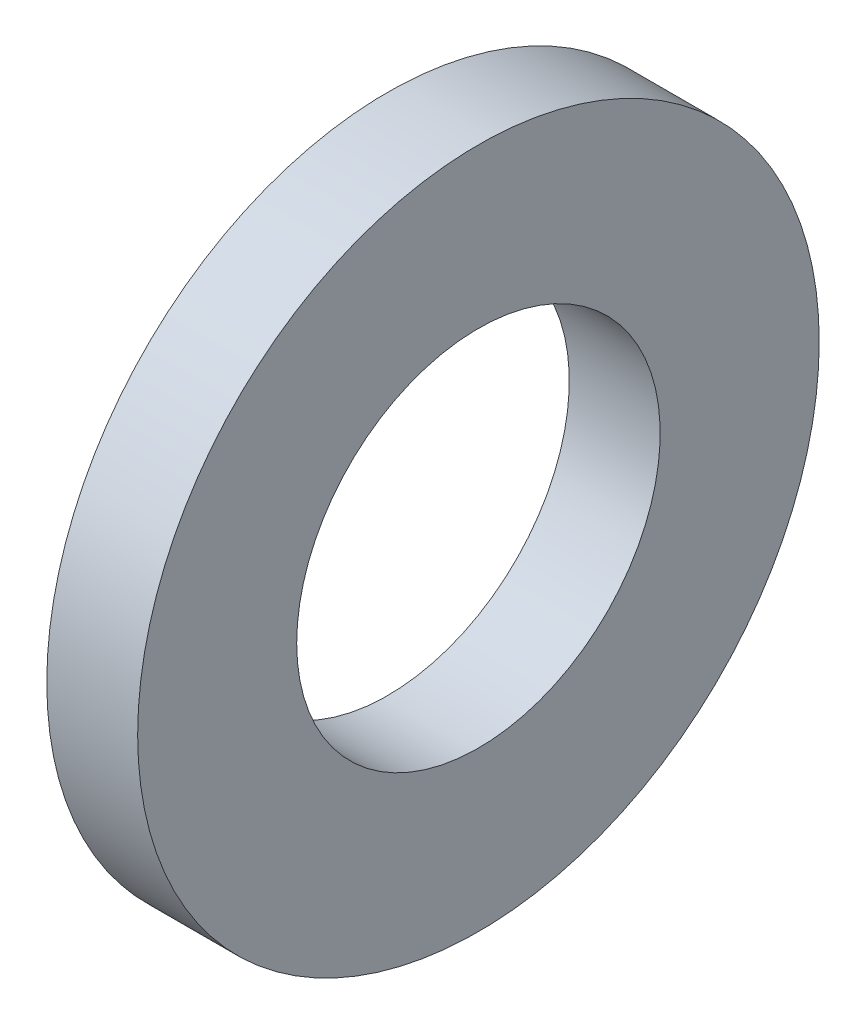
ISO-10303-21;
HEADER;
FILE_DESCRIPTION(('STEP AP214'),'2;1');
FILE_NAME('part.step','',(''),(''),'','','');
FILE_SCHEMA(('AUTOMOTIVE_DESIGN { 1 0 10303 214 1 1 1 1 }'));
ENDSEC;
DATA;
#1=APPLICATION_CONTEXT('core data for automotive mechanical design processes');
#2=APPLICATION_PROTOCOL_DEFINITION('international standard','automotive_design',2000,#1);
#3=PRODUCT_CONTEXT('',#1,'mechanical');
#4=PRODUCT('Part','Part','',(#3));
#5=PRODUCT_RELATED_PRODUCT_CATEGORY('part','',(#4));
#6=PRODUCT_DEFINITION_FORMATION('','',#4);
#7=PRODUCT_DEFINITION_CONTEXT('part definition',#1,'design');
#8=PRODUCT_DEFINITION('design','',#6,#7);
#9=PRODUCT_DEFINITION_SHAPE('','',#8);
#10=(LENGTH_UNIT() NAMED_UNIT(*) SI_UNIT(.MILLI.,.METRE.));
#11=(NAMED_UNIT(*) PLANE_ANGLE_UNIT() SI_UNIT($,.RADIAN.));
#12=(NAMED_UNIT(*) SI_UNIT($,.STERADIAN.) SOLID_ANGLE_UNIT());
#13=UNCERTAINTY_MEASURE_WITH_UNIT(LENGTH_MEASURE(1.E-05),#10,'distance_accuracy_value','');
#14=(GEOMETRIC_REPRESENTATION_CONTEXT(3) GLOBAL_UNCERTAINTY_ASSIGNED_CONTEXT((#13)) GLOBAL_UNIT_ASSIGNED_CONTEXT((#10,
#11,#12)) REPRESENTATION_CONTEXT('',''));
#15=CARTESIAN_POINT('',(0.,0.,0.));
#16=DIRECTION('',(0.,0.,1.));
#17=DIRECTION('',(1.,0.,0.));
#18=AXIS2_PLACEMENT_3D('',#15,#16,#17);
#19=CARTESIAN_POINT('',(-34.9249999999999,0.,0.));
#20=DIRECTION('',(-1.,0.,0.));
#21=DIRECTION('',(0.,0.,1.));
#22=AXIS2_PLACEMENT_3D('',#19,#20,#21);
#23=CYLINDRICAL_SURFACE('',#22,4.);
#24=CARTESIAN_POINT('',(0.,0.,0.));
#25=DIRECTION('',(-1.,0.,0.));
#26=DIRECTION('',(0.,0.,1.));
#27=AXIS2_PLACEMENT_3D('',#24,#25,#26);
#28=CIRCLE('',#27,4.);
#29=CARTESIAN_POINT('',(0.,0.,4.));
#30=VERTEX_POINT('',#29);
#31=EDGE_CURVE('E10',#30,#30,#28,.T.);
#32=ORIENTED_EDGE('',*,*,#31,.F.);
#33=EDGE_LOOP('',(#32));
#34=FACE_BOUND('',#33,.T.);
#35=CARTESIAN_POINT('',(-2.,0.,0.));
#36=DIRECTION('',(-1.,0.,0.));
#37=DIRECTION('',(0.,0.,1.));
#38=AXIS2_PLACEMENT_3D('',#35,#36,#37);
#39=CIRCLE('',#38,4.);
#40=CARTESIAN_POINT('',(-2.,0.,4.));
#41=VERTEX_POINT('',#40);
#42=EDGE_CURVE('E42',#41,#41,#39,.T.);
#43=ORIENTED_EDGE('',*,*,#42,.T.);
#44=EDGE_LOOP('',(#43));
#45=FACE_BOUND('',#44,.T.);
#46=ADVANCED_FACE('F28',(#34,#45),#23,.F.);
#47=CARTESIAN_POINT('',(0.,4.,0.));
#48=DIRECTION('',(-1.,0.,0.));
#49=DIRECTION('',(0.,0.,1.));
#50=AXIS2_PLACEMENT_3D('',#47,#48,#49);
#51=PLANE('',#50);
#52=CARTESIAN_POINT('',(0.,0.,0.));
#53=DIRECTION('',(-1.,0.,0.));
#54=DIRECTION('',(0.,0.,1.));
#55=AXIS2_PLACEMENT_3D('',#52,#53,#54);
#56=CIRCLE('',#55,7.5);
#57=CARTESIAN_POINT('',(0.,0.,7.5));
#58=VERTEX_POINT('',#57);
#59=EDGE_CURVE('E34',#58,#58,#56,.T.);
#60=ORIENTED_EDGE('',*,*,#59,.F.);
#61=EDGE_LOOP('',(#60));
#62=FACE_BOUND('',#61,.T.);
#63=ORIENTED_EDGE('',*,*,#31,.T.);
#64=EDGE_LOOP('',(#63));
#65=FACE_BOUND('',#64,.T.);
#66=ADVANCED_FACE('F57',(#62,#65),#51,.F.);
#67=CARTESIAN_POINT('',(-34.9249999999999,0.,0.));
#68=DIRECTION('',(-1.,0.,0.));
#69=DIRECTION('',(0.,0.,1.));
#70=AXIS2_PLACEMENT_3D('',#67,#68,#69);
#71=CYLINDRICAL_SURFACE('',#70,7.5);
#72=CARTESIAN_POINT('',(-2.,0.,0.));
#73=DIRECTION('',(-1.,0.,0.));
#74=DIRECTION('',(0.,0.,1.));
#75=AXIS2_PLACEMENT_3D('',#72,#73,#74);
#76=CIRCLE('',#75,7.5);
#77=CARTESIAN_POINT('',(-2.,0.,7.5));
#78=VERTEX_POINT('',#77);
#79=EDGE_CURVE('E38',#78,#78,#76,.T.);
#80=ORIENTED_EDGE('',*,*,#79,.F.);
#81=EDGE_LOOP('',(#80));
#82=FACE_BOUND('',#81,.T.);
#83=ORIENTED_EDGE('',*,*,#59,.T.);
#84=EDGE_LOOP('',(#83));
#85=FACE_BOUND('',#84,.T.);
#86=ADVANCED_FACE('F52',(#82,#85),#71,.T.);
#87=CARTESIAN_POINT('',(-2.,7.5,0.));
#88=DIRECTION('',(1.,0.,0.));
#89=DIRECTION('',(0.,0.,-1.));
#90=AXIS2_PLACEMENT_3D('',#87,#88,#89);
#91=PLANE('',#90);
#92=ORIENTED_EDGE('',*,*,#42,.F.);
#93=EDGE_LOOP('',(#92));
#94=FACE_BOUND('',#93,.T.);
#95=ORIENTED_EDGE('',*,*,#79,.T.);
#96=EDGE_LOOP('',(#95));
#97=FACE_BOUND('',#96,.T.);
#98=ADVANCED_FACE('F49',(#94,#97),#91,.F.);
#99=CLOSED_SHELL('',(#46,#66,#86,#98));
#100=MANIFOLD_SOLID_BREP('B2',#99);
#101=ADVANCED_BREP_SHAPE_REPRESENTATION('',(#18,#100),#14);
#102=SHAPE_DEFINITION_REPRESENTATION(#9,#101);
ENDSEC;
END-ISO-10303-21;
